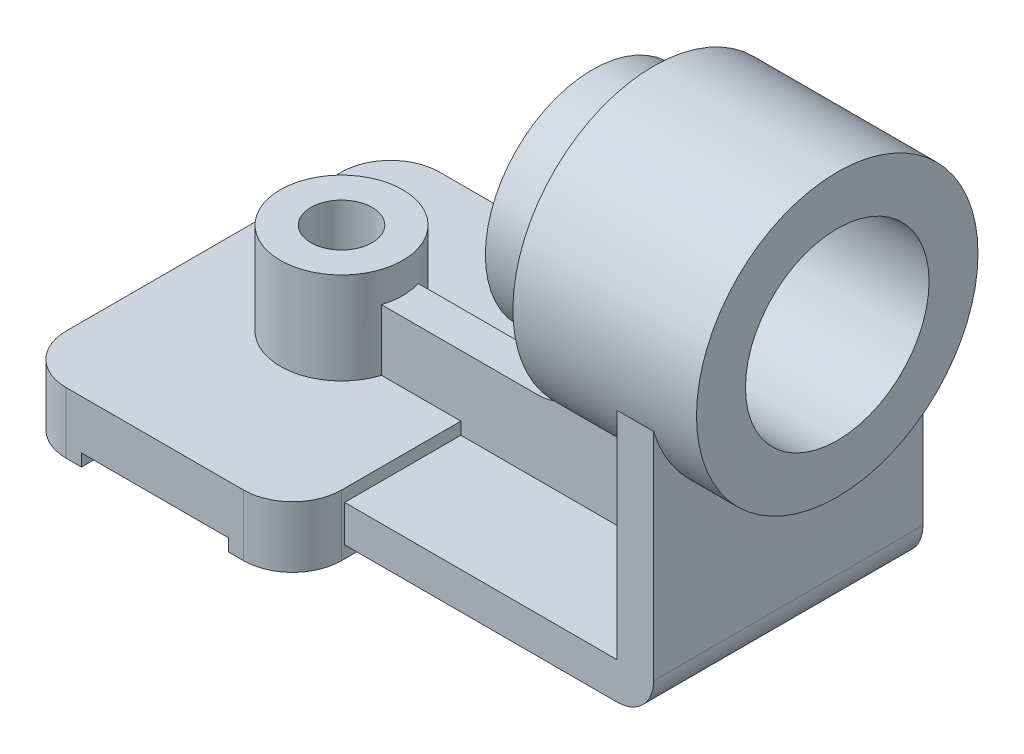
ISO-10303-21;
HEADER;
FILE_DESCRIPTION(('STEP AP214'),'2;1');
FILE_NAME('part.step','',(''),(''),'','','');
FILE_SCHEMA(('AUTOMOTIVE_DESIGN { 1 0 10303 214 1 1 1 1 }'));
ENDSEC;
DATA;
#1=APPLICATION_CONTEXT('core data for automotive mechanical design processes');
#2=APPLICATION_PROTOCOL_DEFINITION('international standard','automotive_design',2000,#1);
#3=PRODUCT_CONTEXT('',#1,'mechanical');
#4=PRODUCT('Part','Part','',(#3));
#5=PRODUCT_RELATED_PRODUCT_CATEGORY('part','',(#4));
#6=PRODUCT_DEFINITION_FORMATION('','',#4);
#7=PRODUCT_DEFINITION_CONTEXT('part definition',#1,'design');
#8=PRODUCT_DEFINITION('design','',#6,#7);
#9=PRODUCT_DEFINITION_SHAPE('','',#8);
#10=(LENGTH_UNIT() NAMED_UNIT(*) SI_UNIT(.MILLI.,.METRE.));
#11=(NAMED_UNIT(*) PLANE_ANGLE_UNIT() SI_UNIT($,.RADIAN.));
#12=(NAMED_UNIT(*) SI_UNIT($,.STERADIAN.) SOLID_ANGLE_UNIT());
#13=UNCERTAINTY_MEASURE_WITH_UNIT(LENGTH_MEASURE(1.E-05),#10,'distance_accuracy_value','');
#14=(GEOMETRIC_REPRESENTATION_CONTEXT(3) GLOBAL_UNCERTAINTY_ASSIGNED_CONTEXT((#13)) GLOBAL_UNIT_ASSIGNED_CONTEXT((#10,
#11,#12)) REPRESENTATION_CONTEXT('',''));
#15=CARTESIAN_POINT('',(0.,0.,0.));
#16=DIRECTION('',(0.,0.,1.));
#17=DIRECTION('',(1.,0.,0.));
#18=AXIS2_PLACEMENT_3D('',#15,#16,#17);
#19=CARTESIAN_POINT('',(0.,0.,3.));
#20=DIRECTION('',(0.,0.,1.));
#21=DIRECTION('',(1.,0.,0.));
#22=AXIS2_PLACEMENT_3D('',#19,#20,#21);
#23=PLANE('',#22);
#24=DIRECTION('',(0.,1.,0.));
#25=VECTOR('',#24,1.);
#26=CARTESIAN_POINT('',(51.,0.,3.));
#27=LINE('',#26,#25);
#28=CARTESIAN_POINT('',(51.,17.1964914980172,3.));
#29=VERTEX_POINT('',#28);
#30=CARTESIAN_POINT('',(51.,22.7590603504333,3.));
#31=VERTEX_POINT('',#30);
#32=EDGE_CURVE('E267',#29,#31,#27,.T.);
#33=ORIENTED_EDGE('',*,*,#32,.T.);
#34=DIRECTION('',(1.,0.,0.));
#35=VECTOR('',#34,1.);
#36=CARTESIAN_POINT('',(41.,22.7590603504333,3.));
#37=LINE('',#36,#35);
#38=CARTESIAN_POINT('',(43.,22.7590603504333,3.));
#39=VERTEX_POINT('',#38);
#40=EDGE_CURVE('E57',#31,#39,#37,.F.);
#41=ORIENTED_EDGE('',*,*,#40,.T.);
#42=DIRECTION('',(0.,1.,0.));
#43=VECTOR('',#42,1.);
#44=CARTESIAN_POINT('',(43.,0.,3.));
#45=LINE('',#44,#43);
#46=CARTESIAN_POINT('',(43.,18.,3.));
#47=VERTEX_POINT('',#46);
#48=EDGE_CURVE('E299',#47,#39,#45,.T.);
#49=ORIENTED_EDGE('',*,*,#48,.F.);
#50=CARTESIAN_POINT('',(35.,18.,3.));
#51=DIRECTION('',(0.,0.,1.));
#52=DIRECTION('',(1.,0.,0.));
#53=AXIS2_PLACEMENT_3D('',#50,#51,#52);
#54=CIRCLE('',#53,8.);
#55=CARTESIAN_POINT('',(35.,10.,3.));
#56=VERTEX_POINT('',#55);
#57=EDGE_CURVE('E288',#56,#47,#54,.T.);
#58=ORIENTED_EDGE('',*,*,#57,.F.);
#59=DIRECTION('',(1.,0.,0.));
#60=VECTOR('',#59,1.);
#61=CARTESIAN_POINT('',(0.,10.,3.));
#62=LINE('',#61,#60);
#63=CARTESIAN_POINT('',(9.53939201416946,10.,3.));
#64=VERTEX_POINT('',#63);
#65=EDGE_CURVE('E291',#64,#56,#62,.T.);
#66=ORIENTED_EDGE('',*,*,#65,.F.);
#67=DIRECTION('',(0.,-1.,0.));
#68=VECTOR('',#67,1.);
#69=CARTESIAN_POINT('',(9.53939201416946,15.,3.));
#70=LINE('',#69,#68);
#71=CARTESIAN_POINT('',(9.53939201416946,0.,3.));
#72=VERTEX_POINT('',#71);
#73=EDGE_CURVE('E322',#72,#64,#70,.F.);
#74=ORIENTED_EDGE('',*,*,#73,.F.);
#75=DIRECTION('',(-1.,0.,0.));
#76=VECTOR('',#75,1.);
#77=CARTESIAN_POINT('',(14.5,0.,3.));
#78=LINE('',#77,#76);
#79=CARTESIAN_POINT('',(22.5,0.,3.));
#80=VERTEX_POINT('',#79);
#81=EDGE_CURVE('E325',#80,#72,#78,.T.);
#82=ORIENTED_EDGE('',*,*,#81,.F.);
#83=DIRECTION('',(0.,-1.,0.));
#84=VECTOR('',#83,1.);
#85=CARTESIAN_POINT('',(22.5,-10.,3.));
#86=LINE('',#85,#84);
#87=CARTESIAN_POINT('',(22.5,-2.,3.));
#88=VERTEX_POINT('',#87);
#89=EDGE_CURVE('E328',#80,#88,#86,.T.);
#90=ORIENTED_EDGE('',*,*,#89,.T.);
#91=DIRECTION('',(-1.,0.,0.));
#92=VECTOR('',#91,1.);
#93=CARTESIAN_POINT('',(0.,-2.,3.));
#94=LINE('',#93,#92);
#95=CARTESIAN_POINT('',(67.,-2.,3.));
#96=VERTEX_POINT('',#95);
#97=EDGE_CURVE('E293',#96,#88,#94,.T.);
#98=ORIENTED_EDGE('',*,*,#97,.F.);
#99=DIRECTION('',(0.,1.,0.));
#100=VECTOR('',#99,1.);
#101=CARTESIAN_POINT('',(67.,0.,3.));
#102=LINE('',#101,#100);
#103=CARTESIAN_POINT('',(67.,17.1964914980172,3.));
#104=VERTEX_POINT('',#103);
#105=EDGE_CURVE('E296',#96,#104,#102,.T.);
#106=ORIENTED_EDGE('',*,*,#105,.T.);
#107=DIRECTION('',(1.,0.,0.));
#108=VECTOR('',#107,1.);
#109=CARTESIAN_POINT('',(51.,17.1964914980172,3.));
#110=LINE('',#109,#108);
#111=EDGE_CURVE('E284',#29,#104,#110,.T.);
#112=ORIENTED_EDGE('',*,*,#111,.F.);
#113=EDGE_LOOP('',(#33,#41,#49,#58,#66,#74,#82,#90,#98,#106,#112));
#114=FACE_BOUND('',#113,.T.);
#115=ADVANCED_FACE('F42',(#114),#23,.T.);
#116=CARTESIAN_POINT('',(0.,0.,-3.));
#117=DIRECTION('',(0.,0.,1.));
#118=DIRECTION('',(1.,0.,0.));
#119=AXIS2_PLACEMENT_3D('',#116,#117,#118);
#120=PLANE('',#119);
#121=DIRECTION('',(1.,0.,0.));
#122=VECTOR('',#121,1.);
#123=CARTESIAN_POINT('',(41.,22.7590603504333,-3.));
#124=LINE('',#123,#122);
#125=CARTESIAN_POINT('',(51.,22.7590603504333,-3.));
#126=VERTEX_POINT('',#125);
#127=CARTESIAN_POINT('',(43.,22.7590603504333,-3.));
#128=VERTEX_POINT('',#127);
#129=EDGE_CURVE('E252',#126,#128,#124,.F.);
#130=ORIENTED_EDGE('',*,*,#129,.F.);
#131=DIRECTION('',(0.,1.,0.));
#132=VECTOR('',#131,1.);
#133=CARTESIAN_POINT('',(51.,0.,-3.));
#134=LINE('',#133,#132);
#135=CARTESIAN_POINT('',(51.,17.1964914980172,-3.));
#136=VERTEX_POINT('',#135);
#137=EDGE_CURVE('E241',#136,#126,#134,.T.);
#138=ORIENTED_EDGE('',*,*,#137,.F.);
#139=DIRECTION('',(1.,0.,0.));
#140=VECTOR('',#139,1.);
#141=CARTESIAN_POINT('',(51.,17.1964914980172,-3.));
#142=LINE('',#141,#140);
#143=CARTESIAN_POINT('',(67.,17.1964914980172,-3.));
#144=VERTEX_POINT('',#143);
#145=EDGE_CURVE('E50',#136,#144,#142,.T.);
#146=ORIENTED_EDGE('',*,*,#145,.T.);
#147=DIRECTION('',(0.,1.,0.));
#148=VECTOR('',#147,1.);
#149=CARTESIAN_POINT('',(67.,0.,-3.));
#150=LINE('',#149,#148);
#151=CARTESIAN_POINT('',(67.,-2.,-3.));
#152=VERTEX_POINT('',#151);
#153=EDGE_CURVE('E307',#152,#144,#150,.T.);
#154=ORIENTED_EDGE('',*,*,#153,.F.);
#155=DIRECTION('',(-1.,0.,0.));
#156=VECTOR('',#155,1.);
#157=CARTESIAN_POINT('',(0.,-2.,-3.));
#158=LINE('',#157,#156);
#159=CARTESIAN_POINT('',(22.5,-2.,-3.));
#160=VERTEX_POINT('',#159);
#161=EDGE_CURVE('E305',#152,#160,#158,.T.);
#162=ORIENTED_EDGE('',*,*,#161,.T.);
#163=DIRECTION('',(0.,-1.,0.));
#164=VECTOR('',#163,1.);
#165=CARTESIAN_POINT('',(22.5,-10.,-3.));
#166=LINE('',#165,#164);
#167=CARTESIAN_POINT('',(22.5,0.,-3.));
#168=VERTEX_POINT('',#167);
#169=EDGE_CURVE('E319',#168,#160,#166,.T.);
#170=ORIENTED_EDGE('',*,*,#169,.F.);
#171=DIRECTION('',(-1.,0.,0.));
#172=VECTOR('',#171,1.);
#173=CARTESIAN_POINT('',(14.5,0.,-3.));
#174=LINE('',#173,#172);
#175=CARTESIAN_POINT('',(9.53939201416946,0.,-3.));
#176=VERTEX_POINT('',#175);
#177=EDGE_CURVE('E317',#168,#176,#174,.T.);
#178=ORIENTED_EDGE('',*,*,#177,.T.);
#179=DIRECTION('',(0.,-1.,0.));
#180=VECTOR('',#179,1.);
#181=CARTESIAN_POINT('',(9.53939201416946,15.,-3.));
#182=LINE('',#181,#180);
#183=CARTESIAN_POINT('',(9.53939201416946,10.,-3.));
#184=VERTEX_POINT('',#183);
#185=EDGE_CURVE('E315',#176,#184,#182,.F.);
#186=ORIENTED_EDGE('',*,*,#185,.T.);
#187=DIRECTION('',(1.,0.,0.));
#188=VECTOR('',#187,1.);
#189=CARTESIAN_POINT('',(0.,10.,-3.));
#190=LINE('',#189,#188);
#191=CARTESIAN_POINT('',(35.,10.,-3.));
#192=VERTEX_POINT('',#191);
#193=EDGE_CURVE('E303',#184,#192,#190,.T.);
#194=ORIENTED_EDGE('',*,*,#193,.T.);
#195=CARTESIAN_POINT('',(35.,18.,-3.));
#196=DIRECTION('',(0.,0.,1.));
#197=DIRECTION('',(1.,0.,0.));
#198=AXIS2_PLACEMENT_3D('',#195,#196,#197);
#199=CIRCLE('',#198,8.);
#200=CARTESIAN_POINT('',(43.,18.,-3.));
#201=VERTEX_POINT('',#200);
#202=EDGE_CURVE('E287',#192,#201,#199,.T.);
#203=ORIENTED_EDGE('',*,*,#202,.T.);
#204=DIRECTION('',(0.,1.,0.));
#205=VECTOR('',#204,1.);
#206=CARTESIAN_POINT('',(43.,0.,-3.));
#207=LINE('',#206,#205);
#208=EDGE_CURVE('E255',#201,#128,#207,.T.);
#209=ORIENTED_EDGE('',*,*,#208,.T.);
#210=EDGE_LOOP('',(#130,#138,#146,#154,#162,#170,#178,#186,#194,#203,#209));
#211=FACE_BOUND('',#210,.T.);
#212=ADVANCED_FACE('F253',(#211),#120,.F.);
#213=CARTESIAN_POINT('',(67.,0.,22.));
#214=DIRECTION('',(-1.,0.,0.));
#215=DIRECTION('',(0.,0.,1.));
#216=AXIS2_PLACEMENT_3D('',#213,#214,#215);
#217=PLANE('',#216);
#218=CARTESIAN_POINT('',(67.,40.,0.));
#219=DIRECTION('',(-1.,0.,0.));
#220=DIRECTION('',(0.,0.,1.));
#221=AXIS2_PLACEMENT_3D('',#218,#219,#220);
#222=CIRCLE('',#221,23.);
#223=CARTESIAN_POINT('',(67.,33.2917960675006,-22.));
#224=VERTEX_POINT('',#223);
#225=EDGE_CURVE('E270',#224,#144,#222,.T.);
#226=ORIENTED_EDGE('',*,*,#225,.F.);
#227=DIRECTION('',(0.,1.,0.));
#228=VECTOR('',#227,1.);
#229=CARTESIAN_POINT('',(67.,0.,-22.));
#230=LINE('',#229,#228);
#231=CARTESIAN_POINT('',(67.,-2.,-22.));
#232=VERTEX_POINT('',#231);
#233=EDGE_CURVE('E356',#232,#224,#230,.T.);
#234=ORIENTED_EDGE('',*,*,#233,.F.);
#235=DIRECTION('',(0.,0.,-1.));
#236=VECTOR('',#235,1.);
#237=CARTESIAN_POINT('',(67.,-2.,22.));
#238=LINE('',#237,#236);
#239=EDGE_CURVE('E370',#152,#232,#238,.T.);
#240=ORIENTED_EDGE('',*,*,#239,.F.);
#241=ORIENTED_EDGE('',*,*,#153,.T.);
#242=EDGE_LOOP('',(#226,#234,#240,#241));
#243=FACE_BOUND('',#242,.T.);
#244=ADVANCED_FACE('F490',(#243),#217,.T.);
#245=CARTESIAN_POINT('',(0.,-2.,22.));
#246=DIRECTION('',(0.,1.,0.));
#247=DIRECTION('',(0.,0.,1.));
#248=AXIS2_PLACEMENT_3D('',#245,#246,#247);
#249=PLANE('',#248);
#250=DIRECTION('',(0.,0.,-1.));
#251=VECTOR('',#250,1.);
#252=CARTESIAN_POINT('',(22.5,-2.,22.));
#253=LINE('',#252,#251);
#254=CARTESIAN_POINT('',(22.5,-2.,-22.));
#255=VERTEX_POINT('',#254);
#256=EDGE_CURVE('E366',#160,#255,#253,.T.);
#257=ORIENTED_EDGE('',*,*,#256,.F.);
#258=ORIENTED_EDGE('',*,*,#161,.F.);
#259=ORIENTED_EDGE('',*,*,#239,.T.);
#260=DIRECTION('',(1.,0.,0.));
#261=VECTOR('',#260,1.);
#262=CARTESIAN_POINT('',(0.,-2.,-22.));
#263=LINE('',#262,#261);
#264=EDGE_CURVE('E359',#255,#232,#263,.T.);
#265=ORIENTED_EDGE('',*,*,#264,.F.);
#266=EDGE_LOOP('',(#257,#258,#259,#265));
#267=FACE_BOUND('',#266,.T.);
#268=ADVANCED_FACE('F518',(#267),#249,.T.);
#269=CARTESIAN_POINT('',(14.5,-10.,-22.5));
#270=DIRECTION('',(0.,-1.,0.));
#271=DIRECTION('',(0.,0.,-1.));
#272=AXIS2_PLACEMENT_3D('',#269,#270,#271);
#273=PLANE('',#272);
#274=DIRECTION('',(0.,0.,-1.));
#275=VECTOR('',#274,1.);
#276=CARTESIAN_POINT('',(-12.,-10.,-22.5));
#277=LINE('',#276,#275);
#278=CARTESIAN_POINT('',(-12.,-10.,30.5));
#279=VERTEX_POINT('',#278);
#280=CARTESIAN_POINT('',(-12.,-10.,-30.5));
#281=VERTEX_POINT('',#280);
#282=EDGE_CURVE('E483',#279,#281,#277,.T.);
#283=ORIENTED_EDGE('',*,*,#282,.F.);
#284=DIRECTION('',(1.,0.,0.));
#285=VECTOR('',#284,1.);
#286=CARTESIAN_POINT('',(-14.5,-10.,30.5));
#287=LINE('',#286,#285);
#288=CARTESIAN_POINT('',(-14.5,-10.,30.5));
#289=VERTEX_POINT('',#288);
#290=EDGE_CURVE('E434',#289,#279,#287,.T.);
#291=ORIENTED_EDGE('',*,*,#290,.F.);
#292=CARTESIAN_POINT('',(-14.5,-10.,22.5));
#293=DIRECTION('',(0.,1.,0.));
#294=DIRECTION('',(0.,0.,1.));
#295=AXIS2_PLACEMENT_3D('',#292,#293,#294);
#296=CIRCLE('',#295,8.);
#297=CARTESIAN_POINT('',(-22.5,-10.,22.5));
#298=VERTEX_POINT('',#297);
#299=EDGE_CURVE('E430',#298,#289,#296,.T.);
#300=ORIENTED_EDGE('',*,*,#299,.F.);
#301=DIRECTION('',(0.,0.,1.));
#302=VECTOR('',#301,1.);
#303=CARTESIAN_POINT('',(-22.5,-10.,-22.5));
#304=LINE('',#303,#302);
#305=CARTESIAN_POINT('',(-22.5,-10.,-22.5));
#306=VERTEX_POINT('',#305);
#307=EDGE_CURVE('E427',#306,#298,#304,.T.);
#308=ORIENTED_EDGE('',*,*,#307,.F.);
#309=CARTESIAN_POINT('',(-14.5,-10.,-22.5));
#310=DIRECTION('',(0.,1.,0.));
#311=DIRECTION('',(0.,0.,1.));
#312=AXIS2_PLACEMENT_3D('',#309,#310,#311);
#313=CIRCLE('',#312,8.);
#314=CARTESIAN_POINT('',(-14.5,-10.,-30.5));
#315=VERTEX_POINT('',#314);
#316=EDGE_CURVE('E424',#315,#306,#313,.T.);
#317=ORIENTED_EDGE('',*,*,#316,.F.);
#318=DIRECTION('',(-1.,0.,0.));
#319=VECTOR('',#318,1.);
#320=CARTESIAN_POINT('',(-14.5,-10.,-30.5));
#321=LINE('',#320,#319);
#322=EDGE_CURVE('E419',#281,#315,#321,.T.);
#323=ORIENTED_EDGE('',*,*,#322,.F.);
#324=EDGE_LOOP('',(#283,#291,#300,#308,#317,#323));
#325=FACE_BOUND('',#324,.T.);
#326=ADVANCED_FACE('F624',(#325),#273,.T.);
#327=CARTESIAN_POINT('',(14.5,-10.,-22.5));
#328=DIRECTION('',(0.,1.,0.));
#329=DIRECTION('',(0.,0.,1.));
#330=AXIS2_PLACEMENT_3D('',#327,#328,#329);
#331=CYLINDRICAL_SURFACE('',#330,8.);
#332=CARTESIAN_POINT('',(14.5,0.,-22.5));
#333=DIRECTION('',(0.,1.,0.));
#334=DIRECTION('',(0.,0.,-1.));
#335=AXIS2_PLACEMENT_3D('',#332,#333,#334);
#336=CIRCLE('',#335,8.);
#337=CARTESIAN_POINT('',(22.5,0.,-22.5));
#338=VERTEX_POINT('',#337);
#339=CARTESIAN_POINT('',(14.5,0.,-30.5));
#340=VERTEX_POINT('',#339);
#341=EDGE_CURVE('E410',#338,#340,#336,.T.);
#342=ORIENTED_EDGE('',*,*,#341,.F.);
#343=DIRECTION('',(0.,1.,0.));
#344=VECTOR('',#343,1.);
#345=CARTESIAN_POINT('',(22.5,-10.,-22.5));
#346=LINE('',#345,#344);
#347=CARTESIAN_POINT('',(22.5,-10.,-22.5));
#348=VERTEX_POINT('',#347);
#349=EDGE_CURVE('E415',#348,#338,#346,.T.);
#350=ORIENTED_EDGE('',*,*,#349,.F.);
#351=CARTESIAN_POINT('',(14.5,-10.,-22.5));
#352=DIRECTION('',(0.,1.,0.));
#353=DIRECTION('',(0.,0.,-1.));
#354=AXIS2_PLACEMENT_3D('',#351,#352,#353);
#355=CIRCLE('',#354,8.);
#356=CARTESIAN_POINT('',(14.5,-10.,-30.5));
#357=VERTEX_POINT('',#356);
#358=EDGE_CURVE('E416',#348,#357,#355,.T.);
#359=ORIENTED_EDGE('',*,*,#358,.T.);
#360=DIRECTION('',(0.,1.,0.));
#361=VECTOR('',#360,1.);
#362=CARTESIAN_POINT('',(14.5,-10.,-30.5));
#363=LINE('',#362,#361);
#364=EDGE_CURVE('E443',#357,#340,#363,.T.);
#365=ORIENTED_EDGE('',*,*,#364,.T.);
#366=EDGE_LOOP('',(#342,#350,#359,#365));
#367=FACE_BOUND('',#366,.T.);
#368=ADVANCED_FACE('F44',(#367),#331,.T.);
#369=CARTESIAN_POINT('',(22.5,-10.,-22.5));
#370=DIRECTION('',(1.,0.,0.));
#371=DIRECTION('',(0.,0.,-1.));
#372=AXIS2_PLACEMENT_3D('',#369,#370,#371);
#373=PLANE('',#372);
#374=ORIENTED_EDGE('',*,*,#89,.F.);
#375=DIRECTION('',(0.,0.,-1.));
#376=VECTOR('',#375,1.);
#377=CARTESIAN_POINT('',(22.5,0.,-22.5));
#378=LINE('',#377,#376);
#379=CARTESIAN_POINT('',(22.5,0.,22.5));
#380=VERTEX_POINT('',#379);
#381=EDGE_CURVE('E420',#380,#80,#378,.T.);
#382=ORIENTED_EDGE('',*,*,#381,.F.);
#383=DIRECTION('',(0.,1.,0.));
#384=VECTOR('',#383,1.);
#385=CARTESIAN_POINT('',(22.5,-10.,22.5));
#386=LINE('',#385,#384);
#387=CARTESIAN_POINT('',(22.5,-10.,22.5));
#388=VERTEX_POINT('',#387);
#389=EDGE_CURVE('E469',#388,#380,#386,.T.);
#390=ORIENTED_EDGE('',*,*,#389,.F.);
#391=DIRECTION('',(0.,0.,-1.));
#392=VECTOR('',#391,1.);
#393=CARTESIAN_POINT('',(22.5,-10.,-22.5));
#394=LINE('',#393,#392);
#395=EDGE_CURVE('E440',#388,#348,#394,.T.);
#396=ORIENTED_EDGE('',*,*,#395,.T.);
#397=ORIENTED_EDGE('',*,*,#349,.T.);
#398=EDGE_CURVE('E464',#168,#338,#378,.T.);
#399=ORIENTED_EDGE('',*,*,#398,.F.);
#400=ORIENTED_EDGE('',*,*,#169,.T.);
#401=ORIENTED_EDGE('',*,*,#256,.T.);
#402=DIRECTION('',(0.,-1.,0.));
#403=VECTOR('',#402,1.);
#404=CARTESIAN_POINT('',(22.5,0.,-22.));
#405=LINE('',#404,#403);
#406=CARTESIAN_POINT('',(22.5,-8.,-22.));
#407=VERTEX_POINT('',#406);
#408=EDGE_CURVE('E335',#255,#407,#405,.T.);
#409=ORIENTED_EDGE('',*,*,#408,.T.);
#410=DIRECTION('',(0.,0.,-1.));
#411=VECTOR('',#410,1.);
#412=CARTESIAN_POINT('',(22.5,-8.,22.));
#413=LINE('',#412,#411);
#414=CARTESIAN_POINT('',(22.5,-8.,22.));
#415=VERTEX_POINT('',#414);
#416=EDGE_CURVE('E348',#415,#407,#413,.T.);
#417=ORIENTED_EDGE('',*,*,#416,.F.);
#418=DIRECTION('',(0.,-1.,0.));
#419=VECTOR('',#418,1.);
#420=CARTESIAN_POINT('',(22.5,0.,22.));
#421=LINE('',#420,#419);
#422=CARTESIAN_POINT('',(22.5,-2.,22.));
#423=VERTEX_POINT('',#422);
#424=EDGE_CURVE('E346',#423,#415,#421,.T.);
#425=ORIENTED_EDGE('',*,*,#424,.F.);
#426=EDGE_CURVE('E367',#423,#88,#253,.T.);
#427=ORIENTED_EDGE('',*,*,#426,.T.);
#428=EDGE_LOOP('',(#374,#382,#390,#396,#397,#399,#400,#401,#409,#417,#425,#427));
#429=FACE_BOUND('',#428,.T.);
#430=ADVANCED_FACE('F514',(#429),#373,.T.);
#431=CARTESIAN_POINT('',(14.5,-10.,22.5));
#432=DIRECTION('',(0.,1.,0.));
#433=DIRECTION('',(0.,0.,1.));
#434=AXIS2_PLACEMENT_3D('',#431,#432,#433);
#435=CYLINDRICAL_SURFACE('',#434,8.);
#436=CARTESIAN_POINT('',(14.5,0.,22.5));
#437=DIRECTION('',(0.,1.,0.));
#438=DIRECTION('',(0.,0.,1.));
#439=AXIS2_PLACEMENT_3D('',#436,#437,#438);
#440=CIRCLE('',#439,8.);
#441=CARTESIAN_POINT('',(14.5,0.,30.5));
#442=VERTEX_POINT('',#441);
#443=EDGE_CURVE('E461',#442,#380,#440,.T.);
#444=ORIENTED_EDGE('',*,*,#443,.F.);
#445=DIRECTION('',(0.,1.,0.));
#446=VECTOR('',#445,1.);
#447=CARTESIAN_POINT('',(14.5,-10.,30.5));
#448=LINE('',#447,#446);
#449=CARTESIAN_POINT('',(14.5,-10.,30.5));
#450=VERTEX_POINT('',#449);
#451=EDGE_CURVE('E471',#450,#442,#448,.T.);
#452=ORIENTED_EDGE('',*,*,#451,.F.);
#453=CARTESIAN_POINT('',(14.5,-10.,22.5));
#454=DIRECTION('',(0.,1.,0.));
#455=DIRECTION('',(0.,0.,1.));
#456=AXIS2_PLACEMENT_3D('',#453,#454,#455);
#457=CIRCLE('',#456,8.);
#458=EDGE_CURVE('E437',#450,#388,#457,.T.);
#459=ORIENTED_EDGE('',*,*,#458,.T.);
#460=ORIENTED_EDGE('',*,*,#389,.T.);
#461=EDGE_LOOP('',(#444,#452,#459,#460));
#462=FACE_BOUND('',#461,.T.);
#463=ADVANCED_FACE('F557',(#462),#435,.T.);
#464=CARTESIAN_POINT('',(-14.5,-10.,30.5));
#465=DIRECTION('',(0.,0.,1.));
#466=DIRECTION('',(1.,0.,0.));
#467=AXIS2_PLACEMENT_3D('',#464,#465,#466);
#468=PLANE('',#467);
#469=DIRECTION('',(0.,-1.,0.));
#470=VECTOR('',#469,1.);
#471=CARTESIAN_POINT('',(-12.,-8.,30.5));
#472=LINE('',#471,#470);
#473=CARTESIAN_POINT('',(-12.,-8.,30.5));
#474=VERTEX_POINT('',#473);
#475=EDGE_CURVE('E387',#474,#279,#472,.T.);
#476=ORIENTED_EDGE('',*,*,#475,.F.);
#477=DIRECTION('',(-1.,0.,0.));
#478=VECTOR('',#477,1.);
#479=CARTESIAN_POINT('',(-12.,-8.,30.5));
#480=LINE('',#479,#478);
#481=CARTESIAN_POINT('',(12.,-8.,30.5));
#482=VERTEX_POINT('',#481);
#483=EDGE_CURVE('E390',#482,#474,#480,.T.);
#484=ORIENTED_EDGE('',*,*,#483,.F.);
#485=DIRECTION('',(0.,1.,0.));
#486=VECTOR('',#485,1.);
#487=CARTESIAN_POINT('',(12.,-8.,30.5));
#488=LINE('',#487,#486);
#489=CARTESIAN_POINT('',(12.,-10.,30.5));
#490=VERTEX_POINT('',#489);
#491=EDGE_CURVE('E386',#490,#482,#488,.T.);
#492=ORIENTED_EDGE('',*,*,#491,.F.);
#493=EDGE_CURVE('E433',#490,#450,#287,.T.);
#494=ORIENTED_EDGE('',*,*,#493,.T.);
#495=ORIENTED_EDGE('',*,*,#451,.T.);
#496=DIRECTION('',(1.,0.,0.));
#497=VECTOR('',#496,1.);
#498=CARTESIAN_POINT('',(-14.5,0.,30.5));
#499=LINE('',#498,#497);
#500=CARTESIAN_POINT('',(-14.5,0.,30.5));
#501=VERTEX_POINT('',#500);
#502=EDGE_CURVE('E458',#501,#442,#499,.T.);
#503=ORIENTED_EDGE('',*,*,#502,.F.);
#504=DIRECTION('',(0.,1.,0.));
#505=VECTOR('',#504,1.);
#506=CARTESIAN_POINT('',(-14.5,-10.,30.5));
#507=LINE('',#506,#505);
#508=EDGE_CURVE('E473',#289,#501,#507,.T.);
#509=ORIENTED_EDGE('',*,*,#508,.F.);
#510=ORIENTED_EDGE('',*,*,#290,.T.);
#511=EDGE_LOOP('',(#476,#484,#492,#494,#495,#503,#509,#510));
#512=FACE_BOUND('',#511,.T.);
#513=ADVANCED_FACE('F550',(#512),#468,.T.);
#514=CARTESIAN_POINT('',(-14.5,-10.,22.5));
#515=DIRECTION('',(0.,1.,0.));
#516=DIRECTION('',(0.,0.,1.));
#517=AXIS2_PLACEMENT_3D('',#514,#515,#516);
#518=CYLINDRICAL_SURFACE('',#517,8.);
#519=CARTESIAN_POINT('',(-14.5,0.,22.5));
#520=DIRECTION('',(0.,1.,0.));
#521=DIRECTION('',(0.,0.,1.));
#522=AXIS2_PLACEMENT_3D('',#519,#520,#521);
#523=CIRCLE('',#522,8.);
#524=CARTESIAN_POINT('',(-22.5,0.,22.5));
#525=VERTEX_POINT('',#524);
#526=EDGE_CURVE('E455',#525,#501,#523,.T.);
#527=ORIENTED_EDGE('',*,*,#526,.F.);
#528=DIRECTION('',(0.,1.,0.));
#529=VECTOR('',#528,1.);
#530=CARTESIAN_POINT('',(-22.5,-10.,22.5));
#531=LINE('',#530,#529);
#532=EDGE_CURVE('E475',#298,#525,#531,.T.);
#533=ORIENTED_EDGE('',*,*,#532,.F.);
#534=ORIENTED_EDGE('',*,*,#299,.T.);
#535=ORIENTED_EDGE('',*,*,#508,.T.);
#536=EDGE_LOOP('',(#527,#533,#534,#535));
#537=FACE_BOUND('',#536,.T.);
#538=ADVANCED_FACE('F545',(#537),#518,.T.);
#539=CARTESIAN_POINT('',(-22.5,-10.,-22.5));
#540=DIRECTION('',(-1.,0.,0.));
#541=DIRECTION('',(0.,0.,1.));
#542=AXIS2_PLACEMENT_3D('',#539,#540,#541);
#543=PLANE('',#542);
#544=DIRECTION('',(0.,0.,1.));
#545=VECTOR('',#544,1.);
#546=CARTESIAN_POINT('',(-22.5,0.,-22.5));
#547=LINE('',#546,#545);
#548=CARTESIAN_POINT('',(-22.5,0.,-22.5));
#549=VERTEX_POINT('',#548);
#550=EDGE_CURVE('E452',#549,#525,#547,.T.);
#551=ORIENTED_EDGE('',*,*,#550,.F.);
#552=DIRECTION('',(0.,1.,0.));
#553=VECTOR('',#552,1.);
#554=CARTESIAN_POINT('',(-22.5,-10.,-22.5));
#555=LINE('',#554,#553);
#556=EDGE_CURVE('E477',#306,#549,#555,.T.);
#557=ORIENTED_EDGE('',*,*,#556,.F.);
#558=ORIENTED_EDGE('',*,*,#307,.T.);
#559=ORIENTED_EDGE('',*,*,#532,.T.);
#560=EDGE_LOOP('',(#551,#557,#558,#559));
#561=FACE_BOUND('',#560,.T.);
#562=ADVANCED_FACE('F541',(#561),#543,.T.);
#563=CARTESIAN_POINT('',(-14.5,-10.,-22.5));
#564=DIRECTION('',(0.,1.,0.));
#565=DIRECTION('',(0.,0.,1.));
#566=AXIS2_PLACEMENT_3D('',#563,#564,#565);
#567=CYLINDRICAL_SURFACE('',#566,8.);
#568=CARTESIAN_POINT('',(-14.5,0.,-22.5));
#569=DIRECTION('',(0.,1.,0.));
#570=DIRECTION('',(0.,0.,1.));
#571=AXIS2_PLACEMENT_3D('',#568,#569,#570);
#572=CIRCLE('',#571,8.);
#573=CARTESIAN_POINT('',(-14.5,0.,-30.5));
#574=VERTEX_POINT('',#573);
#575=EDGE_CURVE('E449',#574,#549,#572,.T.);
#576=ORIENTED_EDGE('',*,*,#575,.F.);
#577=DIRECTION('',(0.,1.,0.));
#578=VECTOR('',#577,1.);
#579=CARTESIAN_POINT('',(-14.5,-10.,-30.5));
#580=LINE('',#579,#578);
#581=EDGE_CURVE('E479',#315,#574,#580,.T.);
#582=ORIENTED_EDGE('',*,*,#581,.F.);
#583=ORIENTED_EDGE('',*,*,#316,.T.);
#584=ORIENTED_EDGE('',*,*,#556,.T.);
#585=EDGE_LOOP('',(#576,#582,#583,#584));
#586=FACE_BOUND('',#585,.T.);
#587=ADVANCED_FACE('F537',(#586),#567,.T.);
#588=CARTESIAN_POINT('',(-14.5,-10.,-30.5));
#589=DIRECTION('',(0.,0.,-1.));
#590=DIRECTION('',(-1.,0.,0.));
#591=AXIS2_PLACEMENT_3D('',#588,#589,#590);
#592=PLANE('',#591);
#593=DIRECTION('',(0.,-1.,0.));
#594=VECTOR('',#593,1.);
#595=CARTESIAN_POINT('',(-12.,-8.,-30.5));
#596=LINE('',#595,#594);
#597=CARTESIAN_POINT('',(-12.,-8.,-30.5));
#598=VERTEX_POINT('',#597);
#599=EDGE_CURVE('E401',#598,#281,#596,.T.);
#600=ORIENTED_EDGE('',*,*,#599,.T.);
#601=ORIENTED_EDGE('',*,*,#322,.T.);
#602=ORIENTED_EDGE('',*,*,#581,.T.);
#603=DIRECTION('',(-1.,0.,0.));
#604=VECTOR('',#603,1.);
#605=CARTESIAN_POINT('',(-14.5,0.,-30.5));
#606=LINE('',#605,#604);
#607=EDGE_CURVE('E446',#340,#574,#606,.T.);
#608=ORIENTED_EDGE('',*,*,#607,.F.);
#609=ORIENTED_EDGE('',*,*,#364,.F.);
#610=CARTESIAN_POINT('',(12.,-10.,-30.5));
#611=VERTEX_POINT('',#610);
#612=EDGE_CURVE('E421',#357,#611,#321,.T.);
#613=ORIENTED_EDGE('',*,*,#612,.T.);
#614=DIRECTION('',(0.,1.,0.));
#615=VECTOR('',#614,1.);
#616=CARTESIAN_POINT('',(12.,-8.,-30.5));
#617=LINE('',#616,#615);
#618=CARTESIAN_POINT('',(12.,-8.,-30.5));
#619=VERTEX_POINT('',#618);
#620=EDGE_CURVE('E397',#611,#619,#617,.T.);
#621=ORIENTED_EDGE('',*,*,#620,.T.);
#622=DIRECTION('',(-1.,0.,0.));
#623=VECTOR('',#622,1.);
#624=CARTESIAN_POINT('',(-12.,-8.,-30.5));
#625=LINE('',#624,#623);
#626=EDGE_CURVE('E389',#619,#598,#625,.T.);
#627=ORIENTED_EDGE('',*,*,#626,.T.);
#628=EDGE_LOOP('',(#600,#601,#602,#608,#609,#613,#621,#627));
#629=FACE_BOUND('',#628,.T.);
#630=ADVANCED_FACE('F531',(#629),#592,.T.);
#631=DIRECTION('',(0.,0.,1.));
#632=VECTOR('',#631,1.);
#633=CARTESIAN_POINT('',(12.,-10.,-22.5));
#634=LINE('',#633,#632);
#635=EDGE_CURVE('E414',#611,#490,#634,.T.);
#636=ORIENTED_EDGE('',*,*,#635,.F.);
#637=ORIENTED_EDGE('',*,*,#612,.F.);
#638=ORIENTED_EDGE('',*,*,#358,.F.);
#639=ORIENTED_EDGE('',*,*,#395,.F.);
#640=ORIENTED_EDGE('',*,*,#458,.F.);
#641=ORIENTED_EDGE('',*,*,#493,.F.);
#642=EDGE_LOOP('',(#636,#637,#638,#639,#640,#641));
#643=FACE_BOUND('',#642,.T.);
#644=ADVANCED_FACE('F617',(#643),#273,.T.);
#645=CARTESIAN_POINT('',(14.5,0.,-22.5));
#646=DIRECTION('',(0.,-1.,0.));
#647=DIRECTION('',(0.,0.,-1.));
#648=AXIS2_PLACEMENT_3D('',#645,#646,#647);
#649=PLANE('',#648);
#650=ORIENTED_EDGE('',*,*,#381,.T.);
#651=ORIENTED_EDGE('',*,*,#81,.T.);
#652=CARTESIAN_POINT('',(0.,0.,0.));
#653=DIRECTION('',(0.,1.,0.));
#654=DIRECTION('',(0.,0.,1.));
#655=AXIS2_PLACEMENT_3D('',#652,#653,#654);
#656=CIRCLE('',#655,10.);
#657=EDGE_CURVE('E411',#176,#72,#656,.T.);
#658=ORIENTED_EDGE('',*,*,#657,.F.);
#659=ORIENTED_EDGE('',*,*,#177,.F.);
#660=ORIENTED_EDGE('',*,*,#398,.T.);
#661=ORIENTED_EDGE('',*,*,#341,.T.);
#662=ORIENTED_EDGE('',*,*,#607,.T.);
#663=ORIENTED_EDGE('',*,*,#575,.T.);
#664=ORIENTED_EDGE('',*,*,#550,.T.);
#665=ORIENTED_EDGE('',*,*,#526,.T.);
#666=ORIENTED_EDGE('',*,*,#502,.T.);
#667=ORIENTED_EDGE('',*,*,#443,.T.);
#668=EDGE_LOOP('',(#650,#651,#658,#659,#660,#661,#662,#663,#664,#665,#666,#667));
#669=FACE_BOUND('',#668,.T.);
#670=ADVANCED_FACE('F523',(#669),#649,.F.);
#671=CARTESIAN_POINT('',(0.,15.,0.));
#672=DIRECTION('',(0.,-1.,0.));
#673=DIRECTION('',(0.,0.,-1.));
#674=AXIS2_PLACEMENT_3D('',#671,#672,#673);
#675=CYLINDRICAL_SURFACE('',#674,10.);
#676=CARTESIAN_POINT('',(0.,15.,0.));
#677=DIRECTION('',(0.,1.,0.));
#678=DIRECTION('',(0.,0.,1.));
#679=AXIS2_PLACEMENT_3D('',#676,#677,#678);
#680=CIRCLE('',#679,10.);
#681=CARTESIAN_POINT('',(0.,15.,10.));
#682=VERTEX_POINT('',#681);
#683=EDGE_CURVE('E407',#682,#682,#680,.T.);
#684=ORIENTED_EDGE('',*,*,#683,.F.);
#685=EDGE_LOOP('',(#684));
#686=FACE_BOUND('',#685,.T.);
#687=ORIENTED_EDGE('',*,*,#657,.T.);
#688=ORIENTED_EDGE('',*,*,#73,.T.);
#689=CARTESIAN_POINT('',(0.,10.,0.));
#690=DIRECTION('',(0.,1.,0.));
#691=DIRECTION('',(-1.,0.,0.));
#692=AXIS2_PLACEMENT_3D('',#689,#690,#691);
#693=CIRCLE('',#692,10.);
#694=EDGE_CURVE('E249',#64,#184,#693,.T.);
#695=ORIENTED_EDGE('',*,*,#694,.T.);
#696=ORIENTED_EDGE('',*,*,#185,.F.);
#697=EDGE_LOOP('',(#687,#688,#695,#696));
#698=FACE_BOUND('',#697,.T.);
#699=ADVANCED_FACE('F605',(#686,#698),#675,.T.);
#700=CARTESIAN_POINT('',(0.,15.,0.));
#701=DIRECTION('',(0.,1.,0.));
#702=DIRECTION('',(0.,0.,1.));
#703=AXIS2_PLACEMENT_3D('',#700,#701,#702);
#704=PLANE('',#703);
#705=CARTESIAN_POINT('',(0.,15.,0.));
#706=DIRECTION('',(0.,1.,0.));
#707=DIRECTION('',(0.,0.,1.));
#708=AXIS2_PLACEMENT_3D('',#705,#706,#707);
#709=CIRCLE('',#708,5.);
#710=CARTESIAN_POINT('',(0.,15.,5.));
#711=VERTEX_POINT('',#710);
#712=EDGE_CURVE('E380',#711,#711,#709,.T.);
#713=ORIENTED_EDGE('',*,*,#712,.F.);
#714=EDGE_LOOP('',(#713));
#715=FACE_BOUND('',#714,.T.);
#716=ORIENTED_EDGE('',*,*,#683,.T.);
#717=EDGE_LOOP('',(#716));
#718=FACE_BOUND('',#717,.T.);
#719=ADVANCED_FACE('F607',(#715,#718),#704,.T.);
#720=CARTESIAN_POINT('',(-12.,-8.,-54.8310501211929));
#721=DIRECTION('',(0.,1.,0.));
#722=DIRECTION('',(0.,0.,1.));
#723=AXIS2_PLACEMENT_3D('',#720,#721,#722);
#724=PLANE('',#723);
#725=CARTESIAN_POINT('',(0.,-8.,0.));
#726=DIRECTION('',(0.,1.,0.));
#727=DIRECTION('',(0.,0.,1.));
#728=AXIS2_PLACEMENT_3D('',#725,#726,#727);
#729=CIRCLE('',#728,5.);
#730=CARTESIAN_POINT('',(0.,-8.,5.));
#731=VERTEX_POINT('',#730);
#732=EDGE_CURVE('E383',#731,#731,#729,.F.);
#733=ORIENTED_EDGE('',*,*,#732,.F.);
#734=EDGE_LOOP('',(#733));
#735=FACE_BOUND('',#734,.T.);
#736=DIRECTION('',(0.,0.,1.));
#737=VECTOR('',#736,1.);
#738=CARTESIAN_POINT('',(12.,-8.,-54.8310501211929));
#739=LINE('',#738,#737);
#740=EDGE_CURVE('E400',#619,#482,#739,.T.);
#741=ORIENTED_EDGE('',*,*,#740,.T.);
#742=ORIENTED_EDGE('',*,*,#483,.T.);
#743=DIRECTION('',(0.,0.,1.));
#744=VECTOR('',#743,1.);
#745=CARTESIAN_POINT('',(-12.,-8.,-54.8310501211929));
#746=LINE('',#745,#744);
#747=EDGE_CURVE('E396',#598,#474,#746,.T.);
#748=ORIENTED_EDGE('',*,*,#747,.F.);
#749=ORIENTED_EDGE('',*,*,#626,.F.);
#750=EDGE_LOOP('',(#741,#742,#748,#749));
#751=FACE_BOUND('',#750,.T.);
#752=ADVANCED_FACE('F614',(#735,#751),#724,.F.);
#753=CARTESIAN_POINT('',(-12.,-8.,-54.8310501211929));
#754=DIRECTION('',(-1.,0.,0.));
#755=DIRECTION('',(0.,0.,1.));
#756=AXIS2_PLACEMENT_3D('',#753,#754,#755);
#757=PLANE('',#756);
#758=ORIENTED_EDGE('',*,*,#282,.T.);
#759=ORIENTED_EDGE('',*,*,#599,.F.);
#760=ORIENTED_EDGE('',*,*,#747,.T.);
#761=ORIENTED_EDGE('',*,*,#475,.T.);
#762=EDGE_LOOP('',(#758,#759,#760,#761));
#763=FACE_BOUND('',#762,.T.);
#764=ADVANCED_FACE('F654',(#763),#757,.F.);
#765=CARTESIAN_POINT('',(12.,-8.,-54.8310501211929));
#766=DIRECTION('',(1.,0.,0.));
#767=DIRECTION('',(0.,0.,-1.));
#768=AXIS2_PLACEMENT_3D('',#765,#766,#767);
#769=PLANE('',#768);
#770=ORIENTED_EDGE('',*,*,#635,.T.);
#771=ORIENTED_EDGE('',*,*,#491,.T.);
#772=ORIENTED_EDGE('',*,*,#740,.F.);
#773=ORIENTED_EDGE('',*,*,#620,.F.);
#774=EDGE_LOOP('',(#770,#771,#772,#773));
#775=FACE_BOUND('',#774,.T.);
#776=ADVANCED_FACE('F658',(#775),#769,.F.);
#777=CARTESIAN_POINT('',(0.,-22.1421356237309,0.));
#778=DIRECTION('',(0.,1.,0.));
#779=DIRECTION('',(0.,0.,1.));
#780=AXIS2_PLACEMENT_3D('',#777,#778,#779);
#781=CYLINDRICAL_SURFACE('',#780,5.);
#782=ORIENTED_EDGE('',*,*,#732,.T.);
#783=EDGE_LOOP('',(#782));
#784=FACE_BOUND('',#783,.T.);
#785=ORIENTED_EDGE('',*,*,#712,.T.);
#786=EDGE_LOOP('',(#785));
#787=FACE_BOUND('',#786,.T.);
#788=ADVANCED_FACE('F667',(#784,#787),#781,.F.);
#789=CARTESIAN_POINT('',(0.,-8.,22.));
#790=DIRECTION('',(0.,1.,0.));
#791=DIRECTION('',(0.,0.,1.));
#792=AXIS2_PLACEMENT_3D('',#789,#790,#791);
#793=PLANE('',#792);
#794=DIRECTION('',(1.,0.,0.));
#795=VECTOR('',#794,1.);
#796=CARTESIAN_POINT('',(0.,-8.,-22.));
#797=LINE('',#796,#795);
#798=CARTESIAN_POINT('',(67.,-8.,-22.));
#799=VERTEX_POINT('',#798);
#800=EDGE_CURVE('E330',#407,#799,#797,.T.);
#801=ORIENTED_EDGE('',*,*,#800,.T.);
#802=DIRECTION('',(0.,0.,-1.));
#803=VECTOR('',#802,1.);
#804=CARTESIAN_POINT('',(67.,-8.,22.));
#805=LINE('',#804,#803);
#806=CARTESIAN_POINT('',(67.,-8.,22.));
#807=VERTEX_POINT('',#806);
#808=EDGE_CURVE('E377',#807,#799,#805,.T.);
#809=ORIENTED_EDGE('',*,*,#808,.F.);
#810=DIRECTION('',(1.,0.,0.));
#811=VECTOR('',#810,1.);
#812=CARTESIAN_POINT('',(0.,-8.,22.));
#813=LINE('',#812,#811);
#814=EDGE_CURVE('E331',#415,#807,#813,.T.);
#815=ORIENTED_EDGE('',*,*,#814,.F.);
#816=ORIENTED_EDGE('',*,*,#416,.T.);
#817=EDGE_LOOP('',(#801,#809,#815,#816));
#818=FACE_BOUND('',#817,.T.);
#819=ADVANCED_FACE('F510',(#818),#793,.F.);
#820=CARTESIAN_POINT('',(67.,-2.,22.));
#821=DIRECTION('',(0.,0.,-1.));
#822=DIRECTION('',(-1.,0.,0.));
#823=AXIS2_PLACEMENT_3D('',#820,#821,#822);
#824=CYLINDRICAL_SURFACE('',#823,6.);
#825=CARTESIAN_POINT('',(67.,-2.,-22.));
#826=DIRECTION('',(0.,0.,1.));
#827=DIRECTION('',(1.,0.,0.));
#828=AXIS2_PLACEMENT_3D('',#825,#826,#827);
#829=CIRCLE('',#828,6.);
#830=CARTESIAN_POINT('',(73.,-2.,-22.));
#831=VERTEX_POINT('',#830);
#832=EDGE_CURVE('E351',#799,#831,#829,.T.);
#833=ORIENTED_EDGE('',*,*,#832,.T.);
#834=DIRECTION('',(0.,0.,-1.));
#835=VECTOR('',#834,1.);
#836=CARTESIAN_POINT('',(73.,-2.,22.));
#837=LINE('',#836,#835);
#838=CARTESIAN_POINT('',(73.,-2.,22.));
#839=VERTEX_POINT('',#838);
#840=EDGE_CURVE('E374',#839,#831,#837,.T.);
#841=ORIENTED_EDGE('',*,*,#840,.F.);
#842=CARTESIAN_POINT('',(67.,-2.,22.));
#843=DIRECTION('',(0.,0.,1.));
#844=DIRECTION('',(1.,0.,0.));
#845=AXIS2_PLACEMENT_3D('',#842,#843,#844);
#846=CIRCLE('',#845,6.);
#847=EDGE_CURVE('E334',#807,#839,#846,.T.);
#848=ORIENTED_EDGE('',*,*,#847,.F.);
#849=ORIENTED_EDGE('',*,*,#808,.T.);
#850=EDGE_LOOP('',(#833,#841,#848,#849));
#851=FACE_BOUND('',#850,.T.);
#852=ADVANCED_FACE('F503',(#851),#824,.T.);
#853=CARTESIAN_POINT('',(73.,0.,22.));
#854=DIRECTION('',(1.,0.,0.));
#855=DIRECTION('',(0.,0.,-1.));
#856=AXIS2_PLACEMENT_3D('',#853,#854,#855);
#857=PLANE('',#856);
#858=CARTESIAN_POINT('',(73.,40.,0.));
#859=DIRECTION('',(1.,0.,0.));
#860=DIRECTION('',(0.,0.,-1.));
#861=AXIS2_PLACEMENT_3D('',#858,#859,#860);
#862=CIRCLE('',#861,23.);
#863=CARTESIAN_POINT('',(73.,33.2917960675006,22.));
#864=VERTEX_POINT('',#863);
#865=CARTESIAN_POINT('',(73.,33.2917960675006,-22.));
#866=VERTEX_POINT('',#865);
#867=EDGE_CURVE('E275',#864,#866,#862,.T.);
#868=ORIENTED_EDGE('',*,*,#867,.F.);
#869=DIRECTION('',(0.,-1.,0.));
#870=VECTOR('',#869,1.);
#871=CARTESIAN_POINT('',(73.,0.,22.));
#872=LINE('',#871,#870);
#873=EDGE_CURVE('E338',#864,#839,#872,.T.);
#874=ORIENTED_EDGE('',*,*,#873,.T.);
#875=ORIENTED_EDGE('',*,*,#840,.T.);
#876=DIRECTION('',(0.,-1.,0.));
#877=VECTOR('',#876,1.);
#878=CARTESIAN_POINT('',(73.,0.,-22.));
#879=LINE('',#878,#877);
#880=EDGE_CURVE('E354',#866,#831,#879,.T.);
#881=ORIENTED_EDGE('',*,*,#880,.F.);
#882=EDGE_LOOP('',(#868,#874,#875,#881));
#883=FACE_BOUND('',#882,.T.);
#884=ADVANCED_FACE('F499',(#883),#857,.T.);
#885=CARTESIAN_POINT('',(67.,40.,0.));
#886=DIRECTION('',(-1.,0.,0.));
#887=DIRECTION('',(0.,0.,1.));
#888=AXIS2_PLACEMENT_3D('',#885,#886,#887);
#889=CIRCLE('',#888,23.);
#890=CARTESIAN_POINT('',(67.,33.2917960675006,22.));
#891=VERTEX_POINT('',#890);
#892=EDGE_CURVE('E281',#104,#891,#889,.T.);
#893=ORIENTED_EDGE('',*,*,#892,.F.);
#894=ORIENTED_EDGE('',*,*,#105,.F.);
#895=CARTESIAN_POINT('',(67.,-2.,22.));
#896=VERTEX_POINT('',#895);
#897=EDGE_CURVE('E371',#896,#96,#238,.T.);
#898=ORIENTED_EDGE('',*,*,#897,.F.);
#899=DIRECTION('',(0.,1.,0.));
#900=VECTOR('',#899,1.);
#901=CARTESIAN_POINT('',(67.,0.,22.));
#902=LINE('',#901,#900);
#903=EDGE_CURVE('E340',#896,#891,#902,.T.);
#904=ORIENTED_EDGE('',*,*,#903,.T.);
#905=EDGE_LOOP('',(#893,#894,#898,#904));
#906=FACE_BOUND('',#905,.T.);
#907=ADVANCED_FACE('F565',(#906),#217,.T.);
#908=ORIENTED_EDGE('',*,*,#97,.T.);
#909=ORIENTED_EDGE('',*,*,#426,.F.);
#910=DIRECTION('',(1.,0.,0.));
#911=VECTOR('',#910,1.);
#912=CARTESIAN_POINT('',(0.,-2.,22.));
#913=LINE('',#912,#911);
#914=EDGE_CURVE('E343',#423,#896,#913,.T.);
#915=ORIENTED_EDGE('',*,*,#914,.T.);
#916=ORIENTED_EDGE('',*,*,#897,.T.);
#917=EDGE_LOOP('',(#908,#909,#915,#916));
#918=FACE_BOUND('',#917,.T.);
#919=ADVANCED_FACE('F561',(#918),#249,.T.);
#920=CARTESIAN_POINT('',(0.,0.,22.));
#921=DIRECTION('',(0.,0.,1.));
#922=DIRECTION('',(1.,0.,0.));
#923=AXIS2_PLACEMENT_3D('',#920,#921,#922);
#924=PLANE('',#923);
#925=DIRECTION('',(1.,0.,0.));
#926=VECTOR('',#925,1.);
#927=CARTESIAN_POINT('',(51.,33.2917960675006,22.));
#928=LINE('',#927,#926);
#929=EDGE_CURVE('E278',#891,#864,#928,.T.);
#930=ORIENTED_EDGE('',*,*,#929,.F.);
#931=ORIENTED_EDGE('',*,*,#903,.F.);
#932=ORIENTED_EDGE('',*,*,#914,.F.);
#933=ORIENTED_EDGE('',*,*,#424,.T.);
#934=ORIENTED_EDGE('',*,*,#814,.T.);
#935=ORIENTED_EDGE('',*,*,#847,.T.);
#936=ORIENTED_EDGE('',*,*,#873,.F.);
#937=EDGE_LOOP('',(#930,#931,#932,#933,#934,#935,#936));
#938=FACE_BOUND('',#937,.T.);
#939=ADVANCED_FACE('F567',(#938),#924,.T.);
#940=CARTESIAN_POINT('',(0.,0.,-22.));
#941=DIRECTION('',(0.,0.,1.));
#942=DIRECTION('',(1.,0.,0.));
#943=AXIS2_PLACEMENT_3D('',#940,#941,#942);
#944=PLANE('',#943);
#945=ORIENTED_EDGE('',*,*,#233,.T.);
#946=DIRECTION('',(1.,0.,0.));
#947=VECTOR('',#946,1.);
#948=CARTESIAN_POINT('',(51.,33.2917960675006,-22.));
#949=LINE('',#948,#947);
#950=EDGE_CURVE('E273',#224,#866,#949,.T.);
#951=ORIENTED_EDGE('',*,*,#950,.T.);
#952=ORIENTED_EDGE('',*,*,#880,.T.);
#953=ORIENTED_EDGE('',*,*,#832,.F.);
#954=ORIENTED_EDGE('',*,*,#800,.F.);
#955=ORIENTED_EDGE('',*,*,#408,.F.);
#956=ORIENTED_EDGE('',*,*,#264,.T.);
#957=EDGE_LOOP('',(#945,#951,#952,#953,#954,#955,#956));
#958=FACE_BOUND('',#957,.T.);
#959=ADVANCED_FACE('F497',(#958),#944,.F.);
#960=CARTESIAN_POINT('',(35.,18.,3.));
#961=DIRECTION('',(0.,0.,-1.));
#962=DIRECTION('',(-1.,0.,0.));
#963=AXIS2_PLACEMENT_3D('',#960,#961,#962);
#964=CYLINDRICAL_SURFACE('',#963,8.);
#965=ORIENTED_EDGE('',*,*,#202,.F.);
#966=DIRECTION('',(0.,0.,-1.));
#967=VECTOR('',#966,1.);
#968=CARTESIAN_POINT('',(35.,10.,3.));
#969=LINE('',#968,#967);
#970=EDGE_CURVE('E312',#56,#192,#969,.T.);
#971=ORIENTED_EDGE('',*,*,#970,.F.);
#972=ORIENTED_EDGE('',*,*,#57,.T.);
#973=DIRECTION('',(0.,0.,-1.));
#974=VECTOR('',#973,1.);
#975=CARTESIAN_POINT('',(43.,18.,3.));
#976=LINE('',#975,#974);
#977=EDGE_CURVE('E301',#47,#201,#976,.T.);
#978=ORIENTED_EDGE('',*,*,#977,.T.);
#979=EDGE_LOOP('',(#965,#971,#972,#978));
#980=FACE_BOUND('',#979,.T.);
#981=ADVANCED_FACE('F574',(#980),#964,.F.);
#982=CARTESIAN_POINT('',(0.,10.,3.));
#983=DIRECTION('',(0.,1.,0.));
#984=DIRECTION('',(-1.,0.,0.));
#985=AXIS2_PLACEMENT_3D('',#982,#983,#984);
#986=PLANE('',#985);
#987=ORIENTED_EDGE('',*,*,#694,.F.);
#988=ORIENTED_EDGE('',*,*,#65,.T.);
#989=ORIENTED_EDGE('',*,*,#970,.T.);
#990=ORIENTED_EDGE('',*,*,#193,.F.);
#991=EDGE_LOOP('',(#987,#988,#989,#990));
#992=FACE_BOUND('',#991,.T.);
#993=ADVANCED_FACE('F592',(#992),#986,.T.);
#994=CARTESIAN_POINT('',(43.,0.,3.));
#995=DIRECTION('',(-1.,0.,0.));
#996=DIRECTION('',(0.,0.,1.));
#997=AXIS2_PLACEMENT_3D('',#994,#995,#996);
#998=PLANE('',#997);
#999=ORIENTED_EDGE('',*,*,#48,.T.);
#1000=CARTESIAN_POINT('',(43.,40.,0.));
#1001=DIRECTION('',(-1.,0.,0.));
#1002=DIRECTION('',(0.,0.,1.));
#1003=AXIS2_PLACEMENT_3D('',#1000,#1001,#1002);
#1004=CIRCLE('',#1003,17.5);
#1005=EDGE_CURVE('E64',#39,#128,#1004,.F.);
#1006=ORIENTED_EDGE('',*,*,#1005,.T.);
#1007=ORIENTED_EDGE('',*,*,#208,.F.);
#1008=ORIENTED_EDGE('',*,*,#977,.F.);
#1009=EDGE_LOOP('',(#999,#1006,#1007,#1008));
#1010=FACE_BOUND('',#1009,.T.);
#1011=ADVANCED_FACE('F589',(#1010),#998,.T.);
#1012=CARTESIAN_POINT('',(51.,40.,0.));
#1013=DIRECTION('',(1.,0.,0.));
#1014=DIRECTION('',(0.,0.,-1.));
#1015=AXIS2_PLACEMENT_3D('',#1012,#1013,#1014);
#1016=CYLINDRICAL_SURFACE('',#1015,23.);
#1017=CARTESIAN_POINT('',(51.,40.,0.));
#1018=DIRECTION('',(1.,0.,0.));
#1019=DIRECTION('',(0.,0.,-1.));
#1020=AXIS2_PLACEMENT_3D('',#1017,#1018,#1019);
#1021=CIRCLE('',#1020,23.);
#1022=EDGE_CURVE('E246',#136,#29,#1021,.T.);
#1023=ORIENTED_EDGE('',*,*,#1022,.T.);
#1024=ORIENTED_EDGE('',*,*,#111,.T.);
#1025=ORIENTED_EDGE('',*,*,#892,.T.);
#1026=ORIENTED_EDGE('',*,*,#929,.T.);
#1027=ORIENTED_EDGE('',*,*,#867,.T.);
#1028=ORIENTED_EDGE('',*,*,#950,.F.);
#1029=ORIENTED_EDGE('',*,*,#225,.T.);
#1030=ORIENTED_EDGE('',*,*,#145,.F.);
#1031=EDGE_LOOP('',(#1023,#1024,#1025,#1026,#1027,#1028,#1029,#1030));
#1032=FACE_BOUND('',#1031,.T.);
#1033=CARTESIAN_POINT('',(81.,40.,0.));
#1034=DIRECTION('',(1.,0.,0.));
#1035=DIRECTION('',(0.,0.,-1.));
#1036=AXIS2_PLACEMENT_3D('',#1033,#1034,#1035);
#1037=CIRCLE('',#1036,23.);
#1038=CARTESIAN_POINT('',(81.,40.,-23.));
#1039=VERTEX_POINT('',#1038);
#1040=EDGE_CURVE('E261',#1039,#1039,#1037,.T.);
#1041=ORIENTED_EDGE('',*,*,#1040,.F.);
#1042=EDGE_LOOP('',(#1041));
#1043=FACE_BOUND('',#1042,.T.);
#1044=ADVANCED_FACE('F493',(#1032,#1043),#1016,.T.);
#1045=CARTESIAN_POINT('',(51.,40.,0.));
#1046=DIRECTION('',(1.,0.,0.));
#1047=DIRECTION('',(0.,0.,-1.));
#1048=AXIS2_PLACEMENT_3D('',#1045,#1046,#1047);
#1049=PLANE('',#1048);
#1050=CARTESIAN_POINT('',(51.,40.,0.));
#1051=DIRECTION('',(1.,0.,0.));
#1052=DIRECTION('',(0.,0.,-1.));
#1053=AXIS2_PLACEMENT_3D('',#1050,#1051,#1052);
#1054=CIRCLE('',#1053,17.5);
#1055=EDGE_CURVE('E11',#31,#126,#1054,.F.);
#1056=ORIENTED_EDGE('',*,*,#1055,.F.);
#1057=ORIENTED_EDGE('',*,*,#32,.F.);
#1058=ORIENTED_EDGE('',*,*,#1022,.F.);
#1059=ORIENTED_EDGE('',*,*,#137,.T.);
#1060=EDGE_LOOP('',(#1056,#1057,#1058,#1059));
#1061=FACE_BOUND('',#1060,.T.);
#1062=ADVANCED_FACE('F243',(#1061),#1049,.F.);
#1063=CARTESIAN_POINT('',(81.,40.,0.));
#1064=DIRECTION('',(1.,0.,0.));
#1065=DIRECTION('',(0.,0.,-1.));
#1066=AXIS2_PLACEMENT_3D('',#1063,#1064,#1065);
#1067=PLANE('',#1066);
#1068=CARTESIAN_POINT('',(81.,40.,0.));
#1069=DIRECTION('',(-1.,0.,0.));
#1070=DIRECTION('',(0.,0.,1.));
#1071=AXIS2_PLACEMENT_3D('',#1068,#1069,#1070);
#1072=CIRCLE('',#1071,15.);
#1073=CARTESIAN_POINT('',(81.,40.,15.));
#1074=VERTEX_POINT('',#1073);
#1075=EDGE_CURVE('E896',#1074,#1074,#1072,.T.);
#1076=ORIENTED_EDGE('',*,*,#1075,.T.);
#1077=EDGE_LOOP('',(#1076));
#1078=FACE_BOUND('',#1077,.T.);
#1079=ORIENTED_EDGE('',*,*,#1040,.T.);
#1080=EDGE_LOOP('',(#1079));
#1081=FACE_BOUND('',#1080,.T.);
#1082=ADVANCED_FACE('F805',(#1078,#1081),#1067,.T.);
#1083=CARTESIAN_POINT('',(41.,40.,0.));
#1084=DIRECTION('',(1.,0.,0.));
#1085=DIRECTION('',(0.,0.,-1.));
#1086=AXIS2_PLACEMENT_3D('',#1083,#1084,#1085);
#1087=CYLINDRICAL_SURFACE('',#1086,17.5);
#1088=ORIENTED_EDGE('',*,*,#40,.F.);
#1089=ORIENTED_EDGE('',*,*,#1055,.T.);
#1090=ORIENTED_EDGE('',*,*,#129,.T.);
#1091=ORIENTED_EDGE('',*,*,#1005,.F.);
#1092=EDGE_LOOP('',(#1088,#1089,#1090,#1091));
#1093=FACE_BOUND('',#1092,.T.);
#1094=CARTESIAN_POINT('',(41.,40.,0.));
#1095=DIRECTION('',(-1.,0.,0.));
#1096=DIRECTION('',(0.,0.,1.));
#1097=AXIS2_PLACEMENT_3D('',#1094,#1095,#1096);
#1098=CIRCLE('',#1097,17.5);
#1099=CARTESIAN_POINT('',(41.,40.,17.5));
#1100=VERTEX_POINT('',#1099);
#1101=EDGE_CURVE('E257',#1100,#1100,#1098,.T.);
#1102=ORIENTED_EDGE('',*,*,#1101,.F.);
#1103=EDGE_LOOP('',(#1102));
#1104=FACE_BOUND('',#1103,.T.);
#1105=ADVANCED_FACE('F259',(#1093,#1104),#1087,.T.);
#1106=CARTESIAN_POINT('',(41.,40.,0.));
#1107=DIRECTION('',(-1.,0.,0.));
#1108=DIRECTION('',(0.,0.,1.));
#1109=AXIS2_PLACEMENT_3D('',#1106,#1107,#1108);
#1110=PLANE('',#1109);
#1111=CARTESIAN_POINT('',(41.,40.,0.));
#1112=DIRECTION('',(-1.,0.,0.));
#1113=DIRECTION('',(0.,0.,1.));
#1114=AXIS2_PLACEMENT_3D('',#1111,#1112,#1113);
#1115=CIRCLE('',#1114,10.);
#1116=CARTESIAN_POINT('',(41.,40.,10.));
#1117=VERTEX_POINT('',#1116);
#1118=EDGE_CURVE('E912',#1117,#1117,#1115,.T.);
#1119=ORIENTED_EDGE('',*,*,#1118,.F.);
#1120=EDGE_LOOP('',(#1119));
#1121=FACE_BOUND('',#1120,.T.);
#1122=ORIENTED_EDGE('',*,*,#1101,.T.);
#1123=EDGE_LOOP('',(#1122));
#1124=FACE_BOUND('',#1123,.T.);
#1125=ADVANCED_FACE('F833',(#1121,#1124),#1110,.T.);
#1126=CARTESIAN_POINT('',(56.,40.,0.));
#1127=DIRECTION('',(-1.,0.,0.));
#1128=DIRECTION('',(0.,0.,1.));
#1129=AXIS2_PLACEMENT_3D('',#1126,#1127,#1128);
#1130=CYLINDRICAL_SURFACE('',#1129,10.);
#1131=CARTESIAN_POINT('',(56.,40.,0.));
#1132=DIRECTION('',(-1.,0.,0.));
#1133=DIRECTION('',(0.,0.,1.));
#1134=AXIS2_PLACEMENT_3D('',#1131,#1132,#1133);
#1135=CIRCLE('',#1134,10.);
#1136=CARTESIAN_POINT('',(56.,40.,10.));
#1137=VERTEX_POINT('',#1136);
#1138=EDGE_CURVE('E907',#1137,#1137,#1135,.T.);
#1139=ORIENTED_EDGE('',*,*,#1138,.F.);
#1140=EDGE_LOOP('',(#1139));
#1141=FACE_BOUND('',#1140,.T.);
#1142=ORIENTED_EDGE('',*,*,#1118,.T.);
#1143=EDGE_LOOP('',(#1142));
#1144=FACE_BOUND('',#1143,.T.);
#1145=ADVANCED_FACE('F842',(#1141,#1144),#1130,.F.);
#1146=CARTESIAN_POINT('',(59.,40.,0.));
#1147=DIRECTION('',(-1.,0.,0.));
#1148=DIRECTION('',(0.,0.,1.));
#1149=AXIS2_PLACEMENT_3D('',#1146,#1147,#1148);
#1150=CYLINDRICAL_SURFACE('',#1149,17.);
#1151=CARTESIAN_POINT('',(59.,40.,0.));
#1152=DIRECTION('',(-1.,0.,0.));
#1153=DIRECTION('',(0.,0.,1.));
#1154=AXIS2_PLACEMENT_3D('',#1151,#1152,#1153);
#1155=CIRCLE('',#1154,17.);
#1156=CARTESIAN_POINT('',(59.,40.,17.));
#1157=VERTEX_POINT('',#1156);
#1158=EDGE_CURVE('E904',#1157,#1157,#1155,.T.);
#1159=ORIENTED_EDGE('',*,*,#1158,.F.);
#1160=EDGE_LOOP('',(#1159));
#1161=FACE_BOUND('',#1160,.T.);
#1162=CARTESIAN_POINT('',(56.,40.,0.));
#1163=DIRECTION('',(-1.,0.,0.));
#1164=DIRECTION('',(0.,0.,1.));
#1165=AXIS2_PLACEMENT_3D('',#1162,#1163,#1164);
#1166=CIRCLE('',#1165,17.);
#1167=CARTESIAN_POINT('',(56.,40.,17.));
#1168=VERTEX_POINT('',#1167);
#1169=EDGE_CURVE('E901',#1168,#1168,#1166,.T.);
#1170=ORIENTED_EDGE('',*,*,#1169,.T.);
#1171=EDGE_LOOP('',(#1170));
#1172=FACE_BOUND('',#1171,.T.);
#1173=ADVANCED_FACE('F852',(#1161,#1172),#1150,.F.);
#1174=CARTESIAN_POINT('',(59.,40.,0.));
#1175=DIRECTION('',(-1.,0.,0.));
#1176=DIRECTION('',(0.,0.,1.));
#1177=AXIS2_PLACEMENT_3D('',#1174,#1175,#1176);
#1178=PLANE('',#1177);
#1179=CARTESIAN_POINT('',(59.,40.,0.));
#1180=DIRECTION('',(-1.,0.,0.));
#1181=DIRECTION('',(0.,0.,1.));
#1182=AXIS2_PLACEMENT_3D('',#1179,#1180,#1181);
#1183=CIRCLE('',#1182,15.);
#1184=CARTESIAN_POINT('',(59.,40.,15.));
#1185=VERTEX_POINT('',#1184);
#1186=EDGE_CURVE('E899',#1185,#1185,#1183,.T.);
#1187=ORIENTED_EDGE('',*,*,#1186,.F.);
#1188=EDGE_LOOP('',(#1187));
#1189=FACE_BOUND('',#1188,.T.);
#1190=ORIENTED_EDGE('',*,*,#1158,.T.);
#1191=EDGE_LOOP('',(#1190));
#1192=FACE_BOUND('',#1191,.T.);
#1193=ADVANCED_FACE('F862',(#1189,#1192),#1178,.T.);
#1194=CARTESIAN_POINT('',(56.,40.,0.));
#1195=DIRECTION('',(-1.,0.,0.));
#1196=DIRECTION('',(0.,0.,1.));
#1197=AXIS2_PLACEMENT_3D('',#1194,#1195,#1196);
#1198=PLANE('',#1197);
#1199=ORIENTED_EDGE('',*,*,#1138,.T.);
#1200=EDGE_LOOP('',(#1199));
#1201=FACE_BOUND('',#1200,.T.);
#1202=ORIENTED_EDGE('',*,*,#1169,.F.);
#1203=EDGE_LOOP('',(#1202));
#1204=FACE_BOUND('',#1203,.T.);
#1205=ADVANCED_FACE('F871',(#1201,#1204),#1198,.F.);
#1206=CARTESIAN_POINT('',(81.,40.,0.));
#1207=DIRECTION('',(-1.,0.,0.));
#1208=DIRECTION('',(0.,0.,1.));
#1209=AXIS2_PLACEMENT_3D('',#1206,#1207,#1208);
#1210=CYLINDRICAL_SURFACE('',#1209,15.);
#1211=ORIENTED_EDGE('',*,*,#1075,.F.);
#1212=EDGE_LOOP('',(#1211));
#1213=FACE_BOUND('',#1212,.T.);
#1214=ORIENTED_EDGE('',*,*,#1186,.T.);
#1215=EDGE_LOOP('',(#1214));
#1216=FACE_BOUND('',#1215,.T.);
#1217=ADVANCED_FACE('F881',(#1213,#1216),#1210,.F.);
#1218=CLOSED_SHELL('',(#115,#212,#244,#268,#326,#368,#430,#463,#513,#538,#562,#587,#630,#644,
#670,#699,#719,#752,#764,#776,#788,#819,#852,#884,#907,#919,#939,#959,#981,#993,#1011,#1044,
#1062,#1082,#1105,#1125,#1145,#1173,#1193,#1205,#1217));
#1219=MANIFOLD_SOLID_BREP('B2',#1218);
#1220=ADVANCED_BREP_SHAPE_REPRESENTATION('',(#18,#1219),#14);
#1221=SHAPE_DEFINITION_REPRESENTATION(#9,#1220);
ENDSEC;
END-ISO-10303-21;
